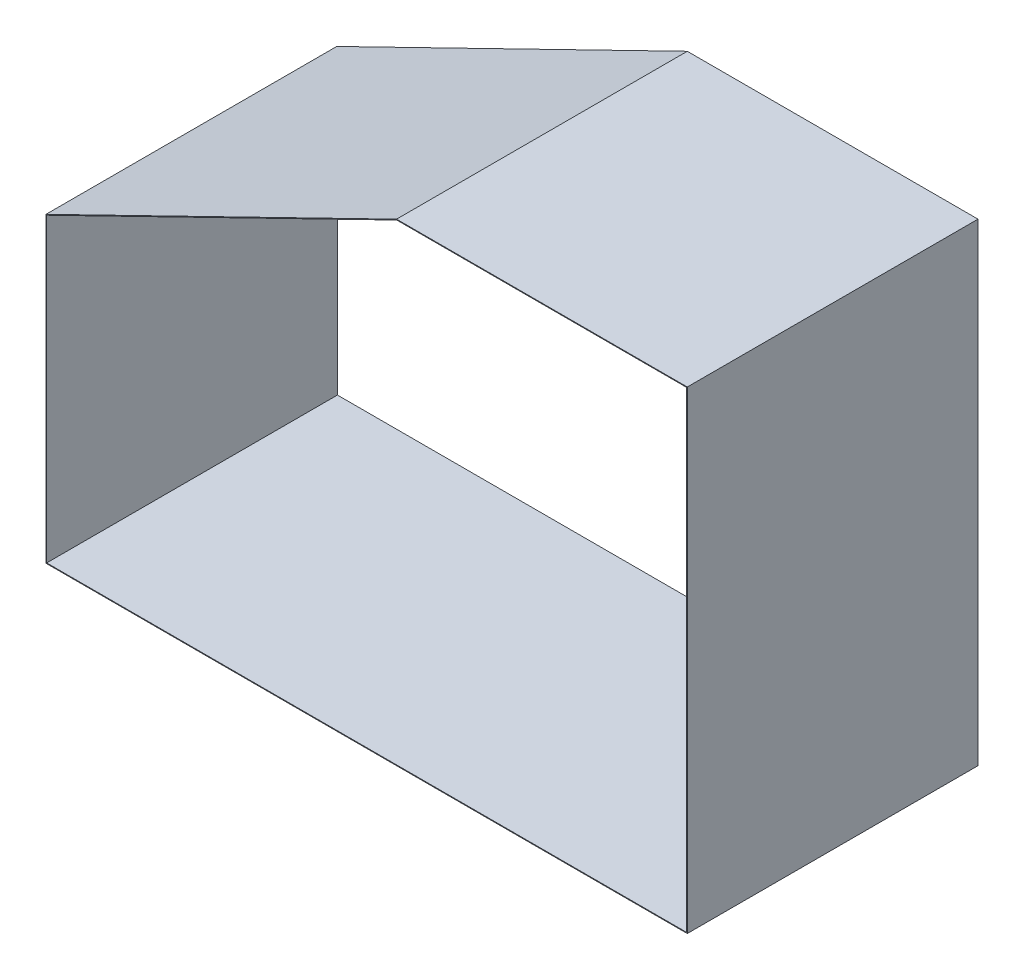
ISO-10303-21;
HEADER;
FILE_DESCRIPTION(('STEP AP214'),'2;1');
FILE_NAME('part.step','',(''),(''),'','','');
FILE_SCHEMA(('AUTOMOTIVE_DESIGN { 1 0 10303 214 1 1 1 1 }'));
ENDSEC;
DATA;
#1=APPLICATION_CONTEXT('core data for automotive mechanical design processes');
#2=APPLICATION_PROTOCOL_DEFINITION('international standard','automotive_design',2000,#1);
#3=PRODUCT_CONTEXT('',#1,'mechanical');
#4=PRODUCT('Part','Part','',(#3));
#5=PRODUCT_RELATED_PRODUCT_CATEGORY('part','',(#4));
#6=PRODUCT_DEFINITION_FORMATION('','',#4);
#7=PRODUCT_DEFINITION_CONTEXT('part definition',#1,'design');
#8=PRODUCT_DEFINITION('design','',#6,#7);
#9=PRODUCT_DEFINITION_SHAPE('','',#8);
#10=(LENGTH_UNIT() NAMED_UNIT(*) SI_UNIT(.MILLI.,.METRE.));
#11=(NAMED_UNIT(*) PLANE_ANGLE_UNIT() SI_UNIT($,.RADIAN.));
#12=(NAMED_UNIT(*) SI_UNIT($,.STERADIAN.) SOLID_ANGLE_UNIT());
#13=UNCERTAINTY_MEASURE_WITH_UNIT(LENGTH_MEASURE(1.E-05),#10,'distance_accuracy_value','');
#14=(GEOMETRIC_REPRESENTATION_CONTEXT(3) GLOBAL_UNCERTAINTY_ASSIGNED_CONTEXT((#13)) GLOBAL_UNIT_ASSIGNED_CONTEXT((#10,
#11,#12)) REPRESENTATION_CONTEXT('',''));
#15=CARTESIAN_POINT('',(0.,0.,0.));
#16=DIRECTION('',(0.,0.,1.));
#17=DIRECTION('',(1.,0.,0.));
#18=AXIS2_PLACEMENT_3D('',#15,#16,#17);
#19=CARTESIAN_POINT('',(0.,0.,1013.2));
#20=DIRECTION('',(0.,0.,-1.));
#21=DIRECTION('',(-1.,0.,0.));
#22=AXIS2_PLACEMENT_3D('',#19,#20,#21);
#23=PLANE('',#22);
#24=DIRECTION('',(-0.898690175729488,-0.438584049011476,0.));
#25=VECTOR('',#24,1.);
#26=CARTESIAN_POINT('',(0.,1053.44,1013.2));
#27=LINE('',#26,#25);
#28=CARTESIAN_POINT('',(1221.8,1649.71,1013.2));
#29=VERTEX_POINT('',#28);
#30=CARTESIAN_POINT('',(0.,1053.44,1013.2));
#31=VERTEX_POINT('',#30);
#32=EDGE_CURVE('E176',#29,#31,#27,.T.);
#33=ORIENTED_EDGE('',*,*,#32,.T.);
#34=DIRECTION('',(0.,-1.,0.));
#35=VECTOR('',#34,1.);
#36=CARTESIAN_POINT('',(0.,0.,1013.2));
#37=LINE('',#36,#35);
#38=CARTESIAN_POINT('',(0.,0.,1013.2));
#39=VERTEX_POINT('',#38);
#40=EDGE_CURVE('E180',#31,#39,#37,.T.);
#41=ORIENTED_EDGE('',*,*,#40,.T.);
#42=DIRECTION('',(1.,0.,0.));
#43=VECTOR('',#42,1.);
#44=CARTESIAN_POINT('',(2235.,1.38777878078145E-13,1013.2));
#45=LINE('',#44,#43);
#46=CARTESIAN_POINT('',(2235.,1.38777878078145E-13,1013.2));
#47=VERTEX_POINT('',#46);
#48=EDGE_CURVE('E184',#39,#47,#45,.T.);
#49=ORIENTED_EDGE('',*,*,#48,.T.);
#50=DIRECTION('',(0.,1.,0.));
#51=VECTOR('',#50,1.);
#52=CARTESIAN_POINT('',(2235.,1649.71,1013.2));
#53=LINE('',#52,#51);
#54=CARTESIAN_POINT('',(2235.,1649.71,1013.2));
#55=VERTEX_POINT('',#54);
#56=EDGE_CURVE('E187',#47,#55,#53,.T.);
#57=ORIENTED_EDGE('',*,*,#56,.T.);
#58=DIRECTION('',(-1.,0.,0.));
#59=VECTOR('',#58,1.);
#60=CARTESIAN_POINT('',(1221.8,1649.71,1013.2));
#61=LINE('',#60,#59);
#62=EDGE_CURVE('E190',#55,#29,#61,.T.);
#63=ORIENTED_EDGE('',*,*,#62,.T.);
#64=EDGE_LOOP('',(#33,#41,#49,#57,#63));
#65=FACE_BOUND('',#64,.T.);
#66=DIRECTION('',(0.,-1.,0.));
#67=VECTOR('',#66,1.);
#68=CARTESIAN_POINT('',(2.49999999999995,2.49999999999989,1013.2));
#69=LINE('',#68,#67);
#70=CARTESIAN_POINT('',(2.49999999999995,1051.87823832131,1013.2));
#71=VERTEX_POINT('',#70);
#72=CARTESIAN_POINT('',(2.49999999999995,2.49999999999989,1013.2));
#73=VERTEX_POINT('',#72);
#74=EDGE_CURVE('E117',#71,#73,#69,.T.);
#75=ORIENTED_EDGE('',*,*,#74,.F.);
#76=DIRECTION('',(-0.898690175729488,-0.438584049011476,0.));
#77=VECTOR('',#76,1.);
#78=CARTESIAN_POINT('',(2.49999999999995,1051.87823832131,1013.2));
#79=LINE('',#78,#77);
#80=CARTESIAN_POINT('',(1222.37748238051,1647.21,1013.2));
#81=VERTEX_POINT('',#80);
#82=EDGE_CURVE('E149',#81,#71,#79,.T.);
#83=ORIENTED_EDGE('',*,*,#82,.F.);
#84=DIRECTION('',(-1.,0.,0.));
#85=VECTOR('',#84,1.);
#86=CARTESIAN_POINT('',(1222.37748238051,1647.21,1013.2));
#87=LINE('',#86,#85);
#88=CARTESIAN_POINT('',(2232.5,1647.21,1013.2));
#89=VERTEX_POINT('',#88);
#90=EDGE_CURVE('E144',#89,#81,#87,.T.);
#91=ORIENTED_EDGE('',*,*,#90,.F.);
#92=DIRECTION('',(0.,1.,0.));
#93=VECTOR('',#92,1.);
#94=CARTESIAN_POINT('',(2232.5,1647.21,1013.2));
#95=LINE('',#94,#93);
#96=CARTESIAN_POINT('',(2232.5,2.50000000000014,1013.2));
#97=VERTEX_POINT('',#96);
#98=EDGE_CURVE('E140',#97,#89,#95,.T.);
#99=ORIENTED_EDGE('',*,*,#98,.F.);
#100=DIRECTION('',(1.,0.,0.));
#101=VECTOR('',#100,1.);
#102=CARTESIAN_POINT('',(2232.5,2.50000000000014,1013.2));
#103=LINE('',#102,#101);
#104=EDGE_CURVE('E126',#73,#97,#103,.T.);
#105=ORIENTED_EDGE('',*,*,#104,.F.);
#106=EDGE_LOOP('',(#75,#83,#91,#99,#105));
#107=FACE_BOUND('',#106,.T.);
#108=ADVANCED_FACE('F39',(#65,#107),#23,.F.);
#109=CARTESIAN_POINT('',(0.,0.,0.));
#110=DIRECTION('',(0.,0.,-1.));
#111=DIRECTION('',(-1.,0.,0.));
#112=AXIS2_PLACEMENT_3D('',#109,#110,#111);
#113=PLANE('',#112);
#114=DIRECTION('',(-0.898690175729488,-0.438584049011476,0.));
#115=VECTOR('',#114,1.);
#116=CARTESIAN_POINT('',(0.,1053.44,0.));
#117=LINE('',#116,#115);
#118=CARTESIAN_POINT('',(1221.8,1649.71,0.));
#119=VERTEX_POINT('',#118);
#120=CARTESIAN_POINT('',(0.,1053.44,0.));
#121=VERTEX_POINT('',#120);
#122=EDGE_CURVE('E135',#119,#121,#117,.T.);
#123=ORIENTED_EDGE('',*,*,#122,.F.);
#124=DIRECTION('',(-1.,0.,0.));
#125=VECTOR('',#124,1.);
#126=CARTESIAN_POINT('',(1221.8,1649.71,0.));
#127=LINE('',#126,#125);
#128=CARTESIAN_POINT('',(2235.,1649.71,0.));
#129=VERTEX_POINT('',#128);
#130=EDGE_CURVE('E181',#129,#119,#127,.T.);
#131=ORIENTED_EDGE('',*,*,#130,.F.);
#132=DIRECTION('',(0.,1.,0.));
#133=VECTOR('',#132,1.);
#134=CARTESIAN_POINT('',(2235.,1649.71,0.));
#135=LINE('',#134,#133);
#136=CARTESIAN_POINT('',(2235.,1.38777878078145E-13,0.));
#137=VERTEX_POINT('',#136);
#138=EDGE_CURVE('E203',#137,#129,#135,.T.);
#139=ORIENTED_EDGE('',*,*,#138,.F.);
#140=DIRECTION('',(1.,0.,0.));
#141=VECTOR('',#140,1.);
#142=CARTESIAN_POINT('',(2235.,1.38777878078145E-13,0.));
#143=LINE('',#142,#141);
#144=CARTESIAN_POINT('',(0.,0.,0.));
#145=VERTEX_POINT('',#144);
#146=EDGE_CURVE('E200',#145,#137,#143,.T.);
#147=ORIENTED_EDGE('',*,*,#146,.F.);
#148=DIRECTION('',(0.,-1.,0.));
#149=VECTOR('',#148,1.);
#150=CARTESIAN_POINT('',(0.,0.,0.));
#151=LINE('',#150,#149);
#152=EDGE_CURVE('E197',#121,#145,#151,.T.);
#153=ORIENTED_EDGE('',*,*,#152,.F.);
#154=EDGE_LOOP('',(#123,#131,#139,#147,#153));
#155=FACE_BOUND('',#154,.T.);
#156=DIRECTION('',(-0.898690175729488,-0.438584049011476,0.));
#157=VECTOR('',#156,1.);
#158=CARTESIAN_POINT('',(2.49999999999995,1051.87823832131,0.));
#159=LINE('',#158,#157);
#160=CARTESIAN_POINT('',(1222.37748238051,1647.21,0.));
#161=VERTEX_POINT('',#160);
#162=CARTESIAN_POINT('',(2.5,1051.87823832131,0.));
#163=VERTEX_POINT('',#162);
#164=EDGE_CURVE('E127',#161,#163,#159,.T.);
#165=ORIENTED_EDGE('',*,*,#164,.T.);
#166=DIRECTION('',(0.,-1.,0.));
#167=VECTOR('',#166,1.);
#168=CARTESIAN_POINT('',(2.49999999999995,2.49999999999989,0.));
#169=LINE('',#168,#167);
#170=CARTESIAN_POINT('',(2.49999999999995,2.49999999999989,0.));
#171=VERTEX_POINT('',#170);
#172=EDGE_CURVE('E63',#163,#171,#169,.T.);
#173=ORIENTED_EDGE('',*,*,#172,.T.);
#174=DIRECTION('',(1.,0.,0.));
#175=VECTOR('',#174,1.);
#176=CARTESIAN_POINT('',(2232.5,2.50000000000014,0.));
#177=LINE('',#176,#175);
#178=CARTESIAN_POINT('',(2232.5,2.50000000000014,0.));
#179=VERTEX_POINT('',#178);
#180=EDGE_CURVE('E133',#171,#179,#177,.T.);
#181=ORIENTED_EDGE('',*,*,#180,.T.);
#182=DIRECTION('',(0.,1.,0.));
#183=VECTOR('',#182,1.);
#184=CARTESIAN_POINT('',(2232.5,1647.21,0.));
#185=LINE('',#184,#183);
#186=CARTESIAN_POINT('',(2232.5,1647.21,0.));
#187=VERTEX_POINT('',#186);
#188=EDGE_CURVE('E156',#179,#187,#185,.T.);
#189=ORIENTED_EDGE('',*,*,#188,.T.);
#190=DIRECTION('',(-1.,0.,0.));
#191=VECTOR('',#190,1.);
#192=CARTESIAN_POINT('',(1222.37748238051,1647.21,0.));
#193=LINE('',#192,#191);
#194=EDGE_CURVE('E160',#187,#161,#193,.T.);
#195=ORIENTED_EDGE('',*,*,#194,.T.);
#196=EDGE_LOOP('',(#165,#173,#181,#189,#195));
#197=FACE_BOUND('',#196,.T.);
#198=ADVANCED_FACE('F230',(#155,#197),#113,.T.);
#199=CARTESIAN_POINT('',(0.,1053.44,1013.2));
#200=DIRECTION('',(0.438584049011476,-0.898690175729488,0.));
#201=DIRECTION('',(0.898690175729489,0.438584049011476,0.));
#202=AXIS2_PLACEMENT_3D('',#199,#200,#201);
#203=PLANE('',#202);
#204=ORIENTED_EDGE('',*,*,#122,.T.);
#205=DIRECTION('',(0.,0.,-1.));
#206=VECTOR('',#205,1.);
#207=CARTESIAN_POINT('',(0.,1053.44,1013.2));
#208=LINE('',#207,#206);
#209=EDGE_CURVE('E11',#31,#121,#208,.T.);
#210=ORIENTED_EDGE('',*,*,#209,.F.);
#211=ORIENTED_EDGE('',*,*,#32,.F.);
#212=DIRECTION('',(0.,0.,-1.));
#213=VECTOR('',#212,1.);
#214=CARTESIAN_POINT('',(1221.8,1649.71,1013.2));
#215=LINE('',#214,#213);
#216=EDGE_CURVE('E193',#29,#119,#215,.T.);
#217=ORIENTED_EDGE('',*,*,#216,.T.);
#218=EDGE_LOOP('',(#204,#210,#211,#217));
#219=FACE_BOUND('',#218,.T.);
#220=ADVANCED_FACE('F41',(#219),#203,.F.);
#221=CARTESIAN_POINT('',(0.,0.,1013.2));
#222=DIRECTION('',(1.,0.,0.));
#223=DIRECTION('',(0.,0.,-1.));
#224=AXIS2_PLACEMENT_3D('',#221,#222,#223);
#225=PLANE('',#224);
#226=ORIENTED_EDGE('',*,*,#152,.T.);
#227=DIRECTION('',(0.,0.,-1.));
#228=VECTOR('',#227,1.);
#229=CARTESIAN_POINT('',(0.,0.,1013.2));
#230=LINE('',#229,#228);
#231=EDGE_CURVE('E48',#39,#145,#230,.T.);
#232=ORIENTED_EDGE('',*,*,#231,.F.);
#233=ORIENTED_EDGE('',*,*,#40,.F.);
#234=ORIENTED_EDGE('',*,*,#209,.T.);
#235=EDGE_LOOP('',(#226,#232,#233,#234));
#236=FACE_BOUND('',#235,.T.);
#237=ADVANCED_FACE('F244',(#236),#225,.F.);
#238=CARTESIAN_POINT('',(2235.,1.38777878078145E-13,1013.2));
#239=DIRECTION('',(0.,1.,0.));
#240=DIRECTION('',(-1.,0.,0.));
#241=AXIS2_PLACEMENT_3D('',#238,#239,#240);
#242=PLANE('',#241);
#243=ORIENTED_EDGE('',*,*,#146,.T.);
#244=DIRECTION('',(0.,0.,-1.));
#245=VECTOR('',#244,1.);
#246=CARTESIAN_POINT('',(2235.,1.38777878078145E-13,1013.2));
#247=LINE('',#246,#245);
#248=EDGE_CURVE('E215',#47,#137,#247,.T.);
#249=ORIENTED_EDGE('',*,*,#248,.F.);
#250=ORIENTED_EDGE('',*,*,#48,.F.);
#251=ORIENTED_EDGE('',*,*,#231,.T.);
#252=EDGE_LOOP('',(#243,#249,#250,#251));
#253=FACE_BOUND('',#252,.T.);
#254=ADVANCED_FACE('F224',(#253),#242,.F.);
#255=CARTESIAN_POINT('',(2235.,1649.71,1013.2));
#256=DIRECTION('',(-1.,0.,0.));
#257=DIRECTION('',(0.,-1.,0.));
#258=AXIS2_PLACEMENT_3D('',#255,#256,#257);
#259=PLANE('',#258);
#260=ORIENTED_EDGE('',*,*,#138,.T.);
#261=DIRECTION('',(0.,0.,-1.));
#262=VECTOR('',#261,1.);
#263=CARTESIAN_POINT('',(2235.,1649.71,1013.2));
#264=LINE('',#263,#262);
#265=EDGE_CURVE('E211',#55,#129,#264,.T.);
#266=ORIENTED_EDGE('',*,*,#265,.F.);
#267=ORIENTED_EDGE('',*,*,#56,.F.);
#268=ORIENTED_EDGE('',*,*,#248,.T.);
#269=EDGE_LOOP('',(#260,#266,#267,#268));
#270=FACE_BOUND('',#269,.T.);
#271=ADVANCED_FACE('F235',(#270),#259,.F.);
#272=CARTESIAN_POINT('',(1221.8,1649.71,1013.2));
#273=DIRECTION('',(0.,-1.,0.));
#274=DIRECTION('',(0.,0.,-1.));
#275=AXIS2_PLACEMENT_3D('',#272,#273,#274);
#276=PLANE('',#275);
#277=ORIENTED_EDGE('',*,*,#130,.T.);
#278=ORIENTED_EDGE('',*,*,#216,.F.);
#279=ORIENTED_EDGE('',*,*,#62,.F.);
#280=ORIENTED_EDGE('',*,*,#265,.T.);
#281=EDGE_LOOP('',(#277,#278,#279,#280));
#282=FACE_BOUND('',#281,.T.);
#283=ADVANCED_FACE('F239',(#282),#276,.F.);
#284=CARTESIAN_POINT('',(2.49999999999995,2.49999999999989,1013.2));
#285=DIRECTION('',(1.,0.,0.));
#286=DIRECTION('',(0.,0.,-1.));
#287=AXIS2_PLACEMENT_3D('',#284,#285,#286);
#288=PLANE('',#287);
#289=ORIENTED_EDGE('',*,*,#172,.F.);
#290=DIRECTION('',(0.,0.,-1.));
#291=VECTOR('',#290,1.);
#292=CARTESIAN_POINT('',(2.49999999999995,1051.87823832131,1013.2));
#293=LINE('',#292,#291);
#294=EDGE_CURVE('E121',#71,#163,#293,.T.);
#295=ORIENTED_EDGE('',*,*,#294,.F.);
#296=ORIENTED_EDGE('',*,*,#74,.T.);
#297=DIRECTION('',(0.,0.,-1.));
#298=VECTOR('',#297,1.);
#299=CARTESIAN_POINT('',(2.49999999999995,2.49999999999989,1013.2));
#300=LINE('',#299,#298);
#301=EDGE_CURVE('E120',#73,#171,#300,.T.);
#302=ORIENTED_EDGE('',*,*,#301,.T.);
#303=EDGE_LOOP('',(#289,#295,#296,#302));
#304=FACE_BOUND('',#303,.T.);
#305=ADVANCED_FACE('F119',(#304),#288,.T.);
#306=CARTESIAN_POINT('',(2232.5,2.50000000000014,1013.2));
#307=DIRECTION('',(0.,1.,0.));
#308=DIRECTION('',(-1.,0.,0.));
#309=AXIS2_PLACEMENT_3D('',#306,#307,#308);
#310=PLANE('',#309);
#311=ORIENTED_EDGE('',*,*,#180,.F.);
#312=ORIENTED_EDGE('',*,*,#301,.F.);
#313=ORIENTED_EDGE('',*,*,#104,.T.);
#314=DIRECTION('',(0.,0.,-1.));
#315=VECTOR('',#314,1.);
#316=CARTESIAN_POINT('',(2232.5,2.50000000000014,1013.2));
#317=LINE('',#316,#315);
#318=EDGE_CURVE('E136',#97,#179,#317,.T.);
#319=ORIENTED_EDGE('',*,*,#318,.T.);
#320=EDGE_LOOP('',(#311,#312,#313,#319));
#321=FACE_BOUND('',#320,.T.);
#322=ADVANCED_FACE('F130',(#321),#310,.T.);
#323=CARTESIAN_POINT('',(2232.5,1647.21,1013.2));
#324=DIRECTION('',(-1.,0.,0.));
#325=DIRECTION('',(0.,-1.,0.));
#326=AXIS2_PLACEMENT_3D('',#323,#324,#325);
#327=PLANE('',#326);
#328=ORIENTED_EDGE('',*,*,#188,.F.);
#329=ORIENTED_EDGE('',*,*,#318,.F.);
#330=ORIENTED_EDGE('',*,*,#98,.T.);
#331=DIRECTION('',(0.,0.,-1.));
#332=VECTOR('',#331,1.);
#333=CARTESIAN_POINT('',(2232.5,1647.21,1013.2));
#334=LINE('',#333,#332);
#335=EDGE_CURVE('E171',#89,#187,#334,.T.);
#336=ORIENTED_EDGE('',*,*,#335,.T.);
#337=EDGE_LOOP('',(#328,#329,#330,#336));
#338=FACE_BOUND('',#337,.T.);
#339=ADVANCED_FACE('F287',(#338),#327,.T.);
#340=CARTESIAN_POINT('',(1222.37748238051,1647.21,1013.2));
#341=DIRECTION('',(0.,-1.,0.));
#342=DIRECTION('',(0.,0.,-1.));
#343=AXIS2_PLACEMENT_3D('',#340,#341,#342);
#344=PLANE('',#343);
#345=ORIENTED_EDGE('',*,*,#194,.F.);
#346=ORIENTED_EDGE('',*,*,#335,.F.);
#347=ORIENTED_EDGE('',*,*,#90,.T.);
#348=DIRECTION('',(0.,0.,-1.));
#349=VECTOR('',#348,1.);
#350=CARTESIAN_POINT('',(1222.37748238051,1647.21,1013.2));
#351=LINE('',#350,#349);
#352=EDGE_CURVE('E55',#81,#161,#351,.T.);
#353=ORIENTED_EDGE('',*,*,#352,.T.);
#354=EDGE_LOOP('',(#345,#346,#347,#353));
#355=FACE_BOUND('',#354,.T.);
#356=ADVANCED_FACE('F293',(#355),#344,.T.);
#357=CARTESIAN_POINT('',(2.49999999999995,1051.87823832131,1013.2));
#358=DIRECTION('',(0.438584049011476,-0.898690175729488,0.));
#359=DIRECTION('',(0.898690175729489,0.438584049011477,0.));
#360=AXIS2_PLACEMENT_3D('',#357,#358,#359);
#361=PLANE('',#360);
#362=ORIENTED_EDGE('',*,*,#164,.F.);
#363=ORIENTED_EDGE('',*,*,#352,.F.);
#364=ORIENTED_EDGE('',*,*,#82,.T.);
#365=ORIENTED_EDGE('',*,*,#294,.T.);
#366=EDGE_LOOP('',(#362,#363,#364,#365));
#367=FACE_BOUND('',#366,.T.);
#368=ADVANCED_FACE('F301',(#367),#361,.T.);
#369=CLOSED_SHELL('',(#108,#198,#220,#237,#254,#271,#283,#305,#322,#339,#356,#368));
#370=MANIFOLD_SOLID_BREP('B2',#369);
#371=ADVANCED_BREP_SHAPE_REPRESENTATION('',(#18,#370),#14);
#372=SHAPE_DEFINITION_REPRESENTATION(#9,#371);
ENDSEC;
END-ISO-10303-21;
